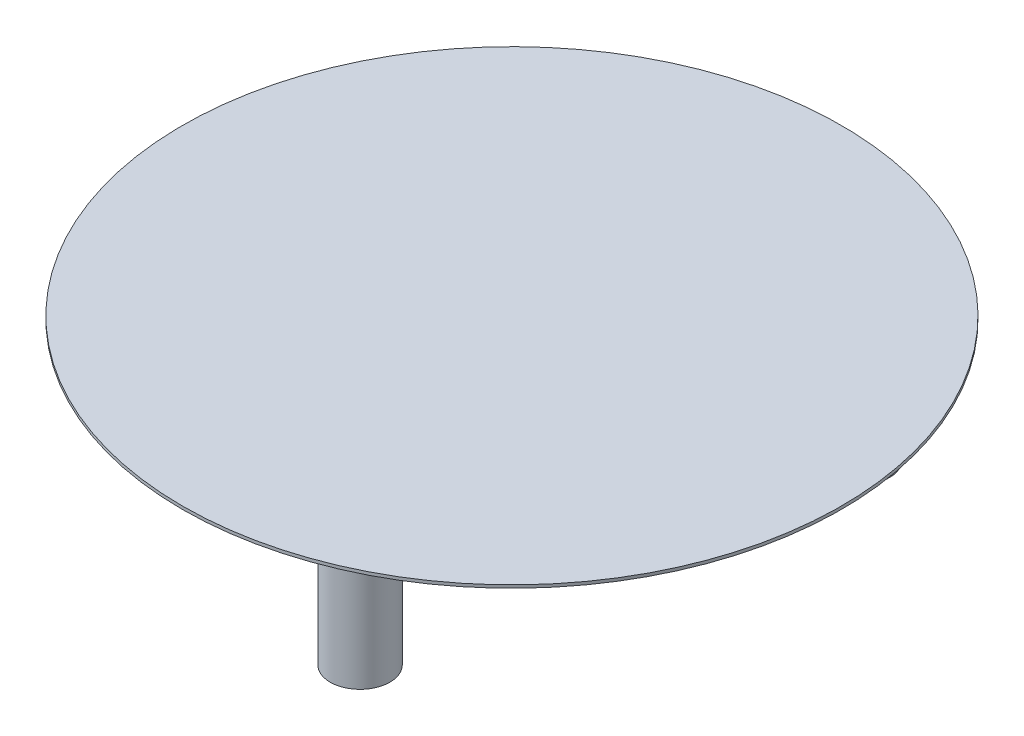
ISO-10303-21;
HEADER;
FILE_DESCRIPTION(('STEP AP214'),'2;1');
FILE_NAME('part.step','',(''),(''),'','','');
FILE_SCHEMA(('AUTOMOTIVE_DESIGN { 1 0 10303 214 1 1 1 1 }'));
ENDSEC;
DATA;
#1=APPLICATION_CONTEXT('core data for automotive mechanical design processes');
#2=APPLICATION_PROTOCOL_DEFINITION('international standard','automotive_design',2000,#1);
#3=PRODUCT_CONTEXT('',#1,'mechanical');
#4=PRODUCT('Part','Part','',(#3));
#5=PRODUCT_RELATED_PRODUCT_CATEGORY('part','',(#4));
#6=PRODUCT_DEFINITION_FORMATION('','',#4);
#7=PRODUCT_DEFINITION_CONTEXT('part definition',#1,'design');
#8=PRODUCT_DEFINITION('design','',#6,#7);
#9=PRODUCT_DEFINITION_SHAPE('','',#8);
#10=(LENGTH_UNIT() NAMED_UNIT(*) SI_UNIT(.MILLI.,.METRE.));
#11=(NAMED_UNIT(*) PLANE_ANGLE_UNIT() SI_UNIT($,.RADIAN.));
#12=(NAMED_UNIT(*) SI_UNIT($,.STERADIAN.) SOLID_ANGLE_UNIT());
#13=UNCERTAINTY_MEASURE_WITH_UNIT(LENGTH_MEASURE(1.E-05),#10,'distance_accuracy_value','');
#14=(GEOMETRIC_REPRESENTATION_CONTEXT(3) GLOBAL_UNCERTAINTY_ASSIGNED_CONTEXT((#13)) GLOBAL_UNIT_ASSIGNED_CONTEXT((#10,
#11,#12)) REPRESENTATION_CONTEXT('',''));
#15=CARTESIAN_POINT('',(0.,0.,0.));
#16=DIRECTION('',(0.,0.,1.));
#17=DIRECTION('',(1.,0.,0.));
#18=AXIS2_PLACEMENT_3D('',#15,#16,#17);
#19=CARTESIAN_POINT('',(0.,0.396875,0.));
#20=DIRECTION('',(0.,-1.,0.));
#21=DIRECTION('',(0.,0.,-1.));
#22=AXIS2_PLACEMENT_3D('',#19,#20,#21);
#23=CYLINDRICAL_SURFACE('',#22,43.815);
#24=CARTESIAN_POINT('',(0.,0.396875,0.));
#25=DIRECTION('',(0.,1.,0.));
#26=DIRECTION('',(0.,0.,1.));
#27=AXIS2_PLACEMENT_3D('',#24,#25,#26);
#28=CIRCLE('',#27,43.815);
#29=CARTESIAN_POINT('',(0.,0.396875,43.815));
#30=VERTEX_POINT('',#29);
#31=EDGE_CURVE('E47',#30,#30,#28,.T.);
#32=ORIENTED_EDGE('',*,*,#31,.F.);
#33=EDGE_LOOP('',(#32));
#34=FACE_BOUND('',#33,.T.);
#35=CARTESIAN_POINT('',(0.,0.,0.));
#36=DIRECTION('',(0.,1.,0.));
#37=DIRECTION('',(0.,0.,1.));
#38=AXIS2_PLACEMENT_3D('',#35,#36,#37);
#39=CIRCLE('',#38,43.815);
#40=CARTESIAN_POINT('',(0.,0.,43.815));
#41=VERTEX_POINT('',#40);
#42=EDGE_CURVE('E50',#41,#41,#39,.T.);
#43=ORIENTED_EDGE('',*,*,#42,.T.);
#44=EDGE_LOOP('',(#43));
#45=FACE_BOUND('',#44,.T.);
#46=ADVANCED_FACE('F33',(#34,#45),#23,.T.);
#47=CARTESIAN_POINT('',(0.,0.396875,0.));
#48=DIRECTION('',(0.,1.,0.));
#49=DIRECTION('',(0.,0.,1.));
#50=AXIS2_PLACEMENT_3D('',#47,#48,#49);
#51=PLANE('',#50);
#52=ORIENTED_EDGE('',*,*,#31,.T.);
#53=EDGE_LOOP('',(#52));
#54=FACE_BOUND('',#53,.T.);
#55=ADVANCED_FACE('F80',(#54),#51,.T.);
#56=CARTESIAN_POINT('',(0.,0.,0.));
#57=DIRECTION('',(0.,1.,0.));
#58=DIRECTION('',(0.,0.,1.));
#59=AXIS2_PLACEMENT_3D('',#56,#57,#58);
#60=PLANE('',#59);
#61=CARTESIAN_POINT('',(10.668,0.,30.861));
#62=DIRECTION('',(0.,1.,0.));
#63=DIRECTION('',(0.,0.,1.));
#64=AXIS2_PLACEMENT_3D('',#61,#62,#63);
#65=CIRCLE('',#64,3.96875);
#66=CARTESIAN_POINT('',(10.668,0.,34.82975));
#67=VERTEX_POINT('',#66);
#68=EDGE_CURVE('E10',#67,#67,#65,.F.);
#69=ORIENTED_EDGE('',*,*,#68,.F.);
#70=EDGE_LOOP('',(#69));
#71=FACE_BOUND('',#70,.T.);
#72=CARTESIAN_POINT('',(-25.908,0.,-19.939));
#73=DIRECTION('',(0.,1.,0.));
#74=DIRECTION('',(0.,0.,1.));
#75=AXIS2_PLACEMENT_3D('',#72,#73,#74);
#76=CIRCLE('',#75,3.96875);
#77=CARTESIAN_POINT('',(-25.908,0.,-15.97025));
#78=VERTEX_POINT('',#77);
#79=EDGE_CURVE('E39',#78,#78,#76,.F.);
#80=ORIENTED_EDGE('',*,*,#79,.F.);
#81=EDGE_LOOP('',(#80));
#82=FACE_BOUND('',#81,.T.);
#83=CARTESIAN_POINT('',(20.32,0.,-25.908));
#84=DIRECTION('',(0.,1.,0.));
#85=DIRECTION('',(0.,0.,1.));
#86=AXIS2_PLACEMENT_3D('',#83,#84,#85);
#87=CIRCLE('',#86,3.96875);
#88=CARTESIAN_POINT('',(20.32,0.,-21.93925));
#89=VERTEX_POINT('',#88);
#90=EDGE_CURVE('E43',#89,#89,#87,.F.);
#91=ORIENTED_EDGE('',*,*,#90,.F.);
#92=EDGE_LOOP('',(#91));
#93=FACE_BOUND('',#92,.T.);
#94=ORIENTED_EDGE('',*,*,#42,.F.);
#95=EDGE_LOOP('',(#94));
#96=FACE_BOUND('',#95,.T.);
#97=ADVANCED_FACE('F85',(#71,#82,#93,#96),#60,.F.);
#98=CARTESIAN_POINT('',(20.32,-19.05,-25.908));
#99=DIRECTION('',(0.,1.,0.));
#100=DIRECTION('',(0.,0.,1.));
#101=AXIS2_PLACEMENT_3D('',#98,#99,#100);
#102=CYLINDRICAL_SURFACE('',#101,3.96875);
#103=CARTESIAN_POINT('',(20.32,-19.05,-25.908));
#104=DIRECTION('',(0.,-1.,0.));
#105=DIRECTION('',(0.,0.,-1.));
#106=AXIS2_PLACEMENT_3D('',#103,#104,#105);
#107=CIRCLE('',#106,3.96875);
#108=CARTESIAN_POINT('',(20.32,-19.05,-21.93925));
#109=VERTEX_POINT('',#108);
#110=EDGE_CURVE('E53',#109,#109,#107,.T.);
#111=CARTESIAN_POINT('',(20.32,-19.05,-21.93925));
#112=CARTESIAN_POINT('',(20.32,-18.8515625,-21.93925));
#113=CARTESIAN_POINT('',(20.32,-18.653125,-21.93925));
#114=CARTESIAN_POINT('',(20.32,-18.25625,-21.93925));
#115=CARTESIAN_POINT('',(20.32,-18.0578125,-21.93925));
#116=CARTESIAN_POINT('',(20.32,-17.6609375,-21.93925));
#117=CARTESIAN_POINT('',(20.32,-17.4625,-21.93925));
#118=CARTESIAN_POINT('',(20.32,-17.065625,-21.93925));
#119=CARTESIAN_POINT('',(20.32,-16.8671875,-21.93925));
#120=CARTESIAN_POINT('',(20.32,-16.4703125,-21.93925));
#121=CARTESIAN_POINT('',(20.32,-16.271875,-21.93925));
#122=CARTESIAN_POINT('',(20.32,-15.875,-21.93925));
#123=CARTESIAN_POINT('',(20.32,-15.6765625,-21.93925));
#124=CARTESIAN_POINT('',(20.32,-15.2796875,-21.93925));
#125=CARTESIAN_POINT('',(20.32,-15.08125,-21.93925));
#126=CARTESIAN_POINT('',(20.32,-14.684375,-21.93925));
#127=CARTESIAN_POINT('',(20.32,-14.4859375,-21.93925));
#128=CARTESIAN_POINT('',(20.32,-14.0890625,-21.93925));
#129=CARTESIAN_POINT('',(20.32,-13.890625,-21.93925));
#130=CARTESIAN_POINT('',(20.32,-13.49375,-21.93925));
#131=CARTESIAN_POINT('',(20.32,-13.2953125,-21.93925));
#132=CARTESIAN_POINT('',(20.32,-12.8984375,-21.93925));
#133=CARTESIAN_POINT('',(20.32,-12.7,-21.93925));
#134=CARTESIAN_POINT('',(20.32,-12.303125,-21.93925));
#135=CARTESIAN_POINT('',(20.32,-12.1046875,-21.93925));
#136=CARTESIAN_POINT('',(20.32,-11.7078125,-21.93925));
#137=CARTESIAN_POINT('',(20.32,-11.509375,-21.93925));
#138=CARTESIAN_POINT('',(20.32,-11.1125,-21.93925));
#139=CARTESIAN_POINT('',(20.32,-10.9140625,-21.93925));
#140=CARTESIAN_POINT('',(20.32,-10.5171875,-21.93925));
#141=CARTESIAN_POINT('',(20.32,-10.31875,-21.93925));
#142=CARTESIAN_POINT('',(20.32,-9.921875,-21.93925));
#143=CARTESIAN_POINT('',(20.32,-9.7234375,-21.93925));
#144=CARTESIAN_POINT('',(20.32,-9.3265625,-21.93925));
#145=CARTESIAN_POINT('',(20.32,-9.128125,-21.93925));
#146=CARTESIAN_POINT('',(20.32,-8.73125,-21.93925));
#147=CARTESIAN_POINT('',(20.32,-8.5328125,-21.93925));
#148=CARTESIAN_POINT('',(20.32,-8.1359375,-21.93925));
#149=CARTESIAN_POINT('',(20.32,-7.9375,-21.93925));
#150=CARTESIAN_POINT('',(20.32,-7.540625,-21.93925));
#151=CARTESIAN_POINT('',(20.32,-7.3421875,-21.93925));
#152=CARTESIAN_POINT('',(20.32,-6.9453125,-21.93925));
#153=CARTESIAN_POINT('',(20.32,-6.746875,-21.93925));
#154=CARTESIAN_POINT('',(20.32,-6.35,-21.93925));
#155=CARTESIAN_POINT('',(20.32,-6.1515625,-21.93925));
#156=CARTESIAN_POINT('',(20.32,-5.7546875,-21.93925));
#157=CARTESIAN_POINT('',(20.32,-5.55625,-21.93925));
#158=CARTESIAN_POINT('',(20.32,-5.159375,-21.93925));
#159=CARTESIAN_POINT('',(20.32,-4.9609375,-21.93925));
#160=CARTESIAN_POINT('',(20.32,-4.5640625,-21.93925));
#161=CARTESIAN_POINT('',(20.32,-4.365625,-21.93925));
#162=CARTESIAN_POINT('',(20.32,-3.96875,-21.93925));
#163=CARTESIAN_POINT('',(20.32,-3.7703125,-21.93925));
#164=CARTESIAN_POINT('',(20.32,-3.3734375,-21.93925));
#165=CARTESIAN_POINT('',(20.32,-3.175,-21.93925));
#166=CARTESIAN_POINT('',(20.32,-2.778125,-21.93925));
#167=CARTESIAN_POINT('',(20.32,-2.5796875,-21.93925));
#168=CARTESIAN_POINT('',(20.32,-2.1828125,-21.93925));
#169=CARTESIAN_POINT('',(20.32,-1.984375,-21.93925));
#170=CARTESIAN_POINT('',(20.32,-1.5875,-21.93925));
#171=CARTESIAN_POINT('',(20.32,-1.3890625,-21.93925));
#172=CARTESIAN_POINT('',(20.32,-0.992187500000001,-21.93925));
#173=CARTESIAN_POINT('',(20.32,-0.793750000000001,-21.93925));
#174=CARTESIAN_POINT('',(20.32,-0.396875,-21.93925));
#175=CARTESIAN_POINT('',(20.32,-0.1984375,-21.93925));
#176=CARTESIAN_POINT('',(20.32,0.,-21.93925));
#177=B_SPLINE_CURVE_WITH_KNOTS('',3,(#111,#112,#113,#114,#115,#116,#117,#118,#119,#120,#121,
#122,#123,#124,#125,#126,#127,#128,#129,#130,#131,#132,#133,#134,#135,#136,#137,#138,#139,#140,
#141,#142,#143,#144,#145,#146,#147,#148,#149,#150,#151,#152,#153,#154,#155,#156,#157,#158,#159,
#160,#161,#162,#163,#164,#165,#166,#167,#168,#169,#170,#171,#172,#173,#174,#175,#176),
.UNSPECIFIED.,.F.,.F.,(4,2,2,2,2,2,2,2,2,2,2,2,2,2,2,2,2,2,2,2,2,2,2,2,2,2,2,2,2,2,2,2,4),(0.,
0.5953125,1.190625,1.7859375,2.38125,2.9765625,3.571875,4.1671875,4.7625,5.3578125,5.953125,
6.5484375,7.14375,7.7390625,8.334375,8.9296875,9.525,10.1203125,10.715625,11.3109375,11.90625,
12.5015625,13.096875,13.6921875,14.2875,14.8828125,15.478125,16.0734375,16.66875,17.2640625,
17.859375,18.4546875,19.05),.UNSPECIFIED.);
#178=EDGE_CURVE('BSEAM93',#109,#89,#177,.T.);
#179=ORIENTED_EDGE('',*,*,#110,.F.);
#180=ORIENTED_EDGE('',*,*,#90,.T.);
#181=ORIENTED_EDGE('',*,*,#178,.T.);
#182=ORIENTED_EDGE('',*,*,#178,.F.);
#183=EDGE_LOOP('',(#179,#181,#180,#182));
#184=FACE_BOUND('',#183,.T.);
#185=ADVANCED_FACE('F93',(#184),#102,.T.);
#186=CARTESIAN_POINT('',(20.32,-19.05,-25.908));
#187=DIRECTION('',(0.,-1.,0.));
#188=DIRECTION('',(0.,0.,-1.));
#189=AXIS2_PLACEMENT_3D('',#186,#187,#188);
#190=PLANE('',#189);
#191=ORIENTED_EDGE('',*,*,#110,.T.);
#192=EDGE_LOOP('',(#191));
#193=FACE_BOUND('',#192,.T.);
#194=ADVANCED_FACE('F98',(#193),#190,.T.);
#195=CARTESIAN_POINT('',(-25.908,-19.05,-19.939));
#196=DIRECTION('',(0.,1.,0.));
#197=DIRECTION('',(0.,0.,1.));
#198=AXIS2_PLACEMENT_3D('',#195,#196,#197);
#199=CYLINDRICAL_SURFACE('',#198,3.96875);
#200=CARTESIAN_POINT('',(-25.908,-19.05,-19.939));
#201=DIRECTION('',(0.,-1.,0.));
#202=DIRECTION('',(0.,0.,-1.));
#203=AXIS2_PLACEMENT_3D('',#200,#201,#202);
#204=CIRCLE('',#203,3.96875);
#205=CARTESIAN_POINT('',(-25.908,-19.05,-15.97025));
#206=VERTEX_POINT('',#205);
#207=EDGE_CURVE('E58',#206,#206,#204,.T.);
#208=CARTESIAN_POINT('',(-25.908,-19.05,-15.97025));
#209=CARTESIAN_POINT('',(-25.908,-18.8515625,-15.97025));
#210=CARTESIAN_POINT('',(-25.908,-18.653125,-15.97025));
#211=CARTESIAN_POINT('',(-25.908,-18.25625,-15.97025));
#212=CARTESIAN_POINT('',(-25.908,-18.0578125,-15.97025));
#213=CARTESIAN_POINT('',(-25.908,-17.6609375,-15.97025));
#214=CARTESIAN_POINT('',(-25.908,-17.4625,-15.97025));
#215=CARTESIAN_POINT('',(-25.908,-17.065625,-15.97025));
#216=CARTESIAN_POINT('',(-25.908,-16.8671875,-15.97025));
#217=CARTESIAN_POINT('',(-25.908,-16.4703125,-15.97025));
#218=CARTESIAN_POINT('',(-25.908,-16.271875,-15.97025));
#219=CARTESIAN_POINT('',(-25.908,-15.875,-15.97025));
#220=CARTESIAN_POINT('',(-25.908,-15.6765625,-15.97025));
#221=CARTESIAN_POINT('',(-25.908,-15.2796875,-15.97025));
#222=CARTESIAN_POINT('',(-25.908,-15.08125,-15.97025));
#223=CARTESIAN_POINT('',(-25.908,-14.684375,-15.97025));
#224=CARTESIAN_POINT('',(-25.908,-14.4859375,-15.97025));
#225=CARTESIAN_POINT('',(-25.908,-14.0890625,-15.97025));
#226=CARTESIAN_POINT('',(-25.908,-13.890625,-15.97025));
#227=CARTESIAN_POINT('',(-25.908,-13.49375,-15.97025));
#228=CARTESIAN_POINT('',(-25.908,-13.2953125,-15.97025));
#229=CARTESIAN_POINT('',(-25.908,-12.8984375,-15.97025));
#230=CARTESIAN_POINT('',(-25.908,-12.7,-15.97025));
#231=CARTESIAN_POINT('',(-25.908,-12.303125,-15.97025));
#232=CARTESIAN_POINT('',(-25.908,-12.1046875,-15.97025));
#233=CARTESIAN_POINT('',(-25.908,-11.7078125,-15.97025));
#234=CARTESIAN_POINT('',(-25.908,-11.509375,-15.97025));
#235=CARTESIAN_POINT('',(-25.908,-11.1125,-15.97025));
#236=CARTESIAN_POINT('',(-25.908,-10.9140625,-15.97025));
#237=CARTESIAN_POINT('',(-25.908,-10.5171875,-15.97025));
#238=CARTESIAN_POINT('',(-25.908,-10.31875,-15.97025));
#239=CARTESIAN_POINT('',(-25.908,-9.921875,-15.97025));
#240=CARTESIAN_POINT('',(-25.908,-9.7234375,-15.97025));
#241=CARTESIAN_POINT('',(-25.908,-9.3265625,-15.97025));
#242=CARTESIAN_POINT('',(-25.908,-9.128125,-15.97025));
#243=CARTESIAN_POINT('',(-25.908,-8.73125,-15.97025));
#244=CARTESIAN_POINT('',(-25.908,-8.5328125,-15.97025));
#245=CARTESIAN_POINT('',(-25.908,-8.1359375,-15.97025));
#246=CARTESIAN_POINT('',(-25.908,-7.9375,-15.97025));
#247=CARTESIAN_POINT('',(-25.908,-7.540625,-15.97025));
#248=CARTESIAN_POINT('',(-25.908,-7.3421875,-15.97025));
#249=CARTESIAN_POINT('',(-25.908,-6.9453125,-15.97025));
#250=CARTESIAN_POINT('',(-25.908,-6.746875,-15.97025));
#251=CARTESIAN_POINT('',(-25.908,-6.35,-15.97025));
#252=CARTESIAN_POINT('',(-25.908,-6.1515625,-15.97025));
#253=CARTESIAN_POINT('',(-25.908,-5.7546875,-15.97025));
#254=CARTESIAN_POINT('',(-25.908,-5.55625,-15.97025));
#255=CARTESIAN_POINT('',(-25.908,-5.159375,-15.97025));
#256=CARTESIAN_POINT('',(-25.908,-4.9609375,-15.97025));
#257=CARTESIAN_POINT('',(-25.908,-4.5640625,-15.97025));
#258=CARTESIAN_POINT('',(-25.908,-4.365625,-15.97025));
#259=CARTESIAN_POINT('',(-25.908,-3.96875,-15.97025));
#260=CARTESIAN_POINT('',(-25.908,-3.7703125,-15.97025));
#261=CARTESIAN_POINT('',(-25.908,-3.3734375,-15.97025));
#262=CARTESIAN_POINT('',(-25.908,-3.175,-15.97025));
#263=CARTESIAN_POINT('',(-25.908,-2.778125,-15.97025));
#264=CARTESIAN_POINT('',(-25.908,-2.5796875,-15.97025));
#265=CARTESIAN_POINT('',(-25.908,-2.1828125,-15.97025));
#266=CARTESIAN_POINT('',(-25.908,-1.984375,-15.97025));
#267=CARTESIAN_POINT('',(-25.908,-1.5875,-15.97025));
#268=CARTESIAN_POINT('',(-25.908,-1.3890625,-15.97025));
#269=CARTESIAN_POINT('',(-25.908,-0.992187500000001,-15.97025));
#270=CARTESIAN_POINT('',(-25.908,-0.793750000000001,-15.97025));
#271=CARTESIAN_POINT('',(-25.908,-0.396875,-15.97025));
#272=CARTESIAN_POINT('',(-25.908,-0.1984375,-15.97025));
#273=CARTESIAN_POINT('',(-25.908,0.,-15.97025));
#274=B_SPLINE_CURVE_WITH_KNOTS('',3,(#208,#209,#210,#211,#212,#213,#214,#215,#216,#217,#218,
#219,#220,#221,#222,#223,#224,#225,#226,#227,#228,#229,#230,#231,#232,#233,#234,#235,#236,#237,
#238,#239,#240,#241,#242,#243,#244,#245,#246,#247,#248,#249,#250,#251,#252,#253,#254,#255,#256,
#257,#258,#259,#260,#261,#262,#263,#264,#265,#266,#267,#268,#269,#270,#271,#272,#273),
.UNSPECIFIED.,.F.,.F.,(4,2,2,2,2,2,2,2,2,2,2,2,2,2,2,2,2,2,2,2,2,2,2,2,2,2,2,2,2,2,2,2,4),(0.,
0.5953125,1.190625,1.7859375,2.38125,2.9765625,3.571875,4.1671875,4.7625,5.3578125,5.953125,
6.5484375,7.14375,7.7390625,8.334375,8.9296875,9.525,10.1203125,10.715625,11.3109375,11.90625,
12.5015625,13.096875,13.6921875,14.2875,14.8828125,15.478125,16.0734375,16.66875,17.2640625,
17.859375,18.4546875,19.05),.UNSPECIFIED.);
#275=EDGE_CURVE('BSEAM76',#206,#78,#274,.T.);
#276=ORIENTED_EDGE('',*,*,#207,.F.);
#277=ORIENTED_EDGE('',*,*,#79,.T.);
#278=ORIENTED_EDGE('',*,*,#275,.T.);
#279=ORIENTED_EDGE('',*,*,#275,.F.);
#280=EDGE_LOOP('',(#276,#278,#277,#279));
#281=FACE_BOUND('',#280,.T.);
#282=ADVANCED_FACE('F76',(#281),#199,.T.);
#283=CARTESIAN_POINT('',(-25.908,-19.05,-19.939));
#284=DIRECTION('',(0.,-1.,0.));
#285=DIRECTION('',(0.,0.,-1.));
#286=AXIS2_PLACEMENT_3D('',#283,#284,#285);
#287=PLANE('',#286);
#288=ORIENTED_EDGE('',*,*,#207,.T.);
#289=EDGE_LOOP('',(#288));
#290=FACE_BOUND('',#289,.T.);
#291=ADVANCED_FACE('F69',(#290),#287,.T.);
#292=CARTESIAN_POINT('',(10.668,-19.05,30.861));
#293=DIRECTION('',(0.,1.,0.));
#294=DIRECTION('',(0.,0.,1.));
#295=AXIS2_PLACEMENT_3D('',#292,#293,#294);
#296=CYLINDRICAL_SURFACE('',#295,3.96875);
#297=CARTESIAN_POINT('',(10.668,-19.05,30.861));
#298=DIRECTION('',(0.,-1.,0.));
#299=DIRECTION('',(0.,0.,-1.));
#300=AXIS2_PLACEMENT_3D('',#297,#298,#299);
#301=CIRCLE('',#300,3.96875);
#302=CARTESIAN_POINT('',(10.668,-19.05,34.82975));
#303=VERTEX_POINT('',#302);
#304=EDGE_CURVE('E61',#303,#303,#301,.T.);
#305=CARTESIAN_POINT('',(10.668,-19.05,34.82975));
#306=CARTESIAN_POINT('',(10.668,-18.8515625,34.82975));
#307=CARTESIAN_POINT('',(10.668,-18.653125,34.82975));
#308=CARTESIAN_POINT('',(10.668,-18.25625,34.82975));
#309=CARTESIAN_POINT('',(10.668,-18.0578125,34.82975));
#310=CARTESIAN_POINT('',(10.668,-17.6609375,34.82975));
#311=CARTESIAN_POINT('',(10.668,-17.4625,34.82975));
#312=CARTESIAN_POINT('',(10.668,-17.065625,34.82975));
#313=CARTESIAN_POINT('',(10.668,-16.8671875,34.82975));
#314=CARTESIAN_POINT('',(10.668,-16.4703125,34.82975));
#315=CARTESIAN_POINT('',(10.668,-16.271875,34.82975));
#316=CARTESIAN_POINT('',(10.668,-15.875,34.82975));
#317=CARTESIAN_POINT('',(10.668,-15.6765625,34.82975));
#318=CARTESIAN_POINT('',(10.668,-15.2796875,34.82975));
#319=CARTESIAN_POINT('',(10.668,-15.08125,34.82975));
#320=CARTESIAN_POINT('',(10.668,-14.684375,34.82975));
#321=CARTESIAN_POINT('',(10.668,-14.4859375,34.82975));
#322=CARTESIAN_POINT('',(10.668,-14.0890625,34.82975));
#323=CARTESIAN_POINT('',(10.668,-13.890625,34.82975));
#324=CARTESIAN_POINT('',(10.668,-13.49375,34.82975));
#325=CARTESIAN_POINT('',(10.668,-13.2953125,34.82975));
#326=CARTESIAN_POINT('',(10.668,-12.8984375,34.82975));
#327=CARTESIAN_POINT('',(10.668,-12.7,34.82975));
#328=CARTESIAN_POINT('',(10.668,-12.303125,34.82975));
#329=CARTESIAN_POINT('',(10.668,-12.1046875,34.82975));
#330=CARTESIAN_POINT('',(10.668,-11.7078125,34.82975));
#331=CARTESIAN_POINT('',(10.668,-11.509375,34.82975));
#332=CARTESIAN_POINT('',(10.668,-11.1125,34.82975));
#333=CARTESIAN_POINT('',(10.668,-10.9140625,34.82975));
#334=CARTESIAN_POINT('',(10.668,-10.5171875,34.82975));
#335=CARTESIAN_POINT('',(10.668,-10.31875,34.82975));
#336=CARTESIAN_POINT('',(10.668,-9.921875,34.82975));
#337=CARTESIAN_POINT('',(10.668,-9.7234375,34.82975));
#338=CARTESIAN_POINT('',(10.668,-9.3265625,34.82975));
#339=CARTESIAN_POINT('',(10.668,-9.128125,34.82975));
#340=CARTESIAN_POINT('',(10.668,-8.73125,34.82975));
#341=CARTESIAN_POINT('',(10.668,-8.5328125,34.82975));
#342=CARTESIAN_POINT('',(10.668,-8.1359375,34.82975));
#343=CARTESIAN_POINT('',(10.668,-7.9375,34.82975));
#344=CARTESIAN_POINT('',(10.668,-7.540625,34.82975));
#345=CARTESIAN_POINT('',(10.668,-7.3421875,34.82975));
#346=CARTESIAN_POINT('',(10.668,-6.9453125,34.82975));
#347=CARTESIAN_POINT('',(10.668,-6.746875,34.82975));
#348=CARTESIAN_POINT('',(10.668,-6.35,34.82975));
#349=CARTESIAN_POINT('',(10.668,-6.1515625,34.82975));
#350=CARTESIAN_POINT('',(10.668,-5.7546875,34.82975));
#351=CARTESIAN_POINT('',(10.668,-5.55625,34.82975));
#352=CARTESIAN_POINT('',(10.668,-5.159375,34.82975));
#353=CARTESIAN_POINT('',(10.668,-4.9609375,34.82975));
#354=CARTESIAN_POINT('',(10.668,-4.5640625,34.82975));
#355=CARTESIAN_POINT('',(10.668,-4.365625,34.82975));
#356=CARTESIAN_POINT('',(10.668,-3.96875,34.82975));
#357=CARTESIAN_POINT('',(10.668,-3.7703125,34.82975));
#358=CARTESIAN_POINT('',(10.668,-3.3734375,34.82975));
#359=CARTESIAN_POINT('',(10.668,-3.175,34.82975));
#360=CARTESIAN_POINT('',(10.668,-2.778125,34.82975));
#361=CARTESIAN_POINT('',(10.668,-2.5796875,34.82975));
#362=CARTESIAN_POINT('',(10.668,-2.1828125,34.82975));
#363=CARTESIAN_POINT('',(10.668,-1.984375,34.82975));
#364=CARTESIAN_POINT('',(10.668,-1.5875,34.82975));
#365=CARTESIAN_POINT('',(10.668,-1.3890625,34.82975));
#366=CARTESIAN_POINT('',(10.668,-0.992187500000001,34.82975));
#367=CARTESIAN_POINT('',(10.668,-0.793750000000001,34.82975));
#368=CARTESIAN_POINT('',(10.668,-0.396875,34.82975));
#369=CARTESIAN_POINT('',(10.668,-0.1984375,34.82975));
#370=CARTESIAN_POINT('',(10.668,0.,34.82975));
#371=B_SPLINE_CURVE_WITH_KNOTS('',3,(#305,#306,#307,#308,#309,#310,#311,#312,#313,#314,#315,
#316,#317,#318,#319,#320,#321,#322,#323,#324,#325,#326,#327,#328,#329,#330,#331,#332,#333,#334,
#335,#336,#337,#338,#339,#340,#341,#342,#343,#344,#345,#346,#347,#348,#349,#350,#351,#352,#353,
#354,#355,#356,#357,#358,#359,#360,#361,#362,#363,#364,#365,#366,#367,#368,#369,#370),
.UNSPECIFIED.,.F.,.F.,(4,2,2,2,2,2,2,2,2,2,2,2,2,2,2,2,2,2,2,2,2,2,2,2,2,2,2,2,2,2,2,2,4),(0.,
0.5953125,1.190625,1.7859375,2.38125,2.9765625,3.571875,4.1671875,4.7625,5.3578125,5.953125,
6.5484375,7.14375,7.7390625,8.334375,8.9296875,9.525,10.1203125,10.715625,11.3109375,11.90625,
12.5015625,13.096875,13.6921875,14.2875,14.8828125,15.478125,16.0734375,16.66875,17.2640625,
17.859375,18.4546875,19.05),.UNSPECIFIED.);
#372=EDGE_CURVE('BSEAM67',#303,#67,#371,.T.);
#373=ORIENTED_EDGE('',*,*,#304,.F.);
#374=ORIENTED_EDGE('',*,*,#68,.T.);
#375=ORIENTED_EDGE('',*,*,#372,.T.);
#376=ORIENTED_EDGE('',*,*,#372,.F.);
#377=EDGE_LOOP('',(#373,#375,#374,#376));
#378=FACE_BOUND('',#377,.T.);
#379=ADVANCED_FACE('F67',(#378),#296,.T.);
#380=CARTESIAN_POINT('',(10.668,-19.05,30.861));
#381=DIRECTION('',(0.,-1.,0.));
#382=DIRECTION('',(0.,0.,-1.));
#383=AXIS2_PLACEMENT_3D('',#380,#381,#382);
#384=PLANE('',#383);
#385=ORIENTED_EDGE('',*,*,#304,.T.);
#386=EDGE_LOOP('',(#385));
#387=FACE_BOUND('',#386,.T.);
#388=ADVANCED_FACE('F65',(#387),#384,.T.);
#389=CLOSED_SHELL('',(#46,#55,#97,#185,#194,#282,#291,#379,#388));
#390=MANIFOLD_SOLID_BREP('B2',#389);
#391=ADVANCED_BREP_SHAPE_REPRESENTATION('',(#18,#390),#14);
#392=SHAPE_DEFINITION_REPRESENTATION(#9,#391);
ENDSEC;
END-ISO-10303-21;
